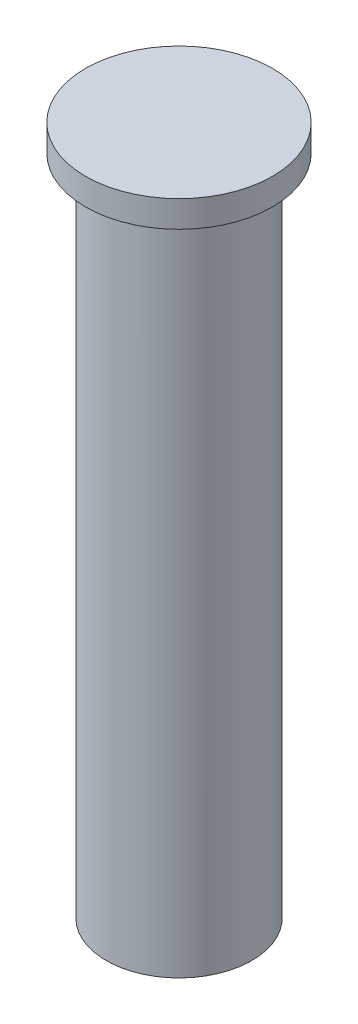
ISO-10303-21;
HEADER;
FILE_DESCRIPTION(('STEP AP214'),'2;1');
FILE_NAME('part.step','',(''),(''),'','','');
FILE_SCHEMA(('AUTOMOTIVE_DESIGN { 1 0 10303 214 1 1 1 1 }'));
ENDSEC;
DATA;
#1=APPLICATION_CONTEXT('core data for automotive mechanical design processes');
#2=APPLICATION_PROTOCOL_DEFINITION('international standard','automotive_design',2000,#1);
#3=PRODUCT_CONTEXT('',#1,'mechanical');
#4=PRODUCT('Part','Part','',(#3));
#5=PRODUCT_RELATED_PRODUCT_CATEGORY('part','',(#4));
#6=PRODUCT_DEFINITION_FORMATION('','',#4);
#7=PRODUCT_DEFINITION_CONTEXT('part definition',#1,'design');
#8=PRODUCT_DEFINITION('design','',#6,#7);
#9=PRODUCT_DEFINITION_SHAPE('','',#8);
#10=(LENGTH_UNIT() NAMED_UNIT(*) SI_UNIT(.MILLI.,.METRE.));
#11=(NAMED_UNIT(*) PLANE_ANGLE_UNIT() SI_UNIT($,.RADIAN.));
#12=(NAMED_UNIT(*) SI_UNIT($,.STERADIAN.) SOLID_ANGLE_UNIT());
#13=UNCERTAINTY_MEASURE_WITH_UNIT(LENGTH_MEASURE(1.E-05),#10,'distance_accuracy_value','');
#14=(GEOMETRIC_REPRESENTATION_CONTEXT(3) GLOBAL_UNCERTAINTY_ASSIGNED_CONTEXT((#13)) GLOBAL_UNIT_ASSIGNED_CONTEXT((#10,
#11,#12)) REPRESENTATION_CONTEXT('',''));
#15=CARTESIAN_POINT('',(0.,0.,0.));
#16=DIRECTION('',(0.,0.,1.));
#17=DIRECTION('',(1.,0.,0.));
#18=AXIS2_PLACEMENT_3D('',#15,#16,#17);
#19=CARTESIAN_POINT('',(0.,50.8,0.));
#20=DIRECTION('',(0.,-1.,0.));
#21=DIRECTION('',(0.,0.,-1.));
#22=AXIS2_PLACEMENT_3D('',#19,#20,#21);
#23=CYLINDRICAL_SURFACE('',#22,6.985);
#24=CARTESIAN_POINT('',(0.,50.8,0.));
#25=DIRECTION('',(0.,1.,0.));
#26=DIRECTION('',(0.,0.,1.));
#27=AXIS2_PLACEMENT_3D('',#24,#25,#26);
#28=CIRCLE('',#27,6.985);
#29=CARTESIAN_POINT('',(0.,50.8,6.985));
#30=VERTEX_POINT('',#29);
#31=EDGE_CURVE('E10',#30,#30,#28,.T.);
#32=ORIENTED_EDGE('',*,*,#31,.F.);
#33=EDGE_LOOP('',(#32));
#34=FACE_BOUND('',#33,.T.);
#35=CARTESIAN_POINT('',(0.,-12.7,0.));
#36=DIRECTION('',(0.,-1.,0.));
#37=DIRECTION('',(0.,0.,-1.));
#38=AXIS2_PLACEMENT_3D('',#35,#36,#37);
#39=CIRCLE('',#38,6.985);
#40=CARTESIAN_POINT('',(0.,-12.7,-6.985));
#41=VERTEX_POINT('',#40);
#42=EDGE_CURVE('E55',#41,#41,#39,.T.);
#43=ORIENTED_EDGE('',*,*,#42,.F.);
#44=EDGE_LOOP('',(#43));
#45=FACE_BOUND('',#44,.T.);
#46=ADVANCED_FACE('F37',(#34,#45),#23,.T.);
#47=CARTESIAN_POINT('',(0.,53.34,0.));
#48=DIRECTION('',(0.,-1.,0.));
#49=DIRECTION('',(0.,0.,-1.));
#50=AXIS2_PLACEMENT_3D('',#47,#48,#49);
#51=CYLINDRICAL_SURFACE('',#50,8.95691472582998);
#52=CARTESIAN_POINT('',(0.,53.34,0.));
#53=DIRECTION('',(0.,1.,0.));
#54=DIRECTION('',(0.,0.,1.));
#55=AXIS2_PLACEMENT_3D('',#52,#53,#54);
#56=CIRCLE('',#55,8.95691472582998);
#57=CARTESIAN_POINT('',(0.,53.34,8.95691472582998));
#58=VERTEX_POINT('',#57);
#59=EDGE_CURVE('E44',#58,#58,#56,.T.);
#60=ORIENTED_EDGE('',*,*,#59,.F.);
#61=EDGE_LOOP('',(#60));
#62=FACE_BOUND('',#61,.T.);
#63=CARTESIAN_POINT('',(0.,50.8,0.));
#64=DIRECTION('',(0.,1.,0.));
#65=DIRECTION('',(0.,0.,1.));
#66=AXIS2_PLACEMENT_3D('',#63,#64,#65);
#67=CIRCLE('',#66,8.95691472582998);
#68=CARTESIAN_POINT('',(0.,50.8,8.95691472582998));
#69=VERTEX_POINT('',#68);
#70=EDGE_CURVE('E49',#69,#69,#67,.T.);
#71=ORIENTED_EDGE('',*,*,#70,.T.);
#72=EDGE_LOOP('',(#71));
#73=FACE_BOUND('',#72,.T.);
#74=ADVANCED_FACE('F64',(#62,#73),#51,.T.);
#75=CARTESIAN_POINT('',(0.,53.34,0.));
#76=DIRECTION('',(0.,1.,0.));
#77=DIRECTION('',(0.,0.,1.));
#78=AXIS2_PLACEMENT_3D('',#75,#76,#77);
#79=PLANE('',#78);
#80=ORIENTED_EDGE('',*,*,#59,.T.);
#81=EDGE_LOOP('',(#80));
#82=FACE_BOUND('',#81,.T.);
#83=ADVANCED_FACE('F69',(#82),#79,.T.);
#84=CARTESIAN_POINT('',(0.,50.8,0.));
#85=DIRECTION('',(0.,1.,0.));
#86=DIRECTION('',(0.,0.,1.));
#87=AXIS2_PLACEMENT_3D('',#84,#85,#86);
#88=PLANE('',#87);
#89=ORIENTED_EDGE('',*,*,#31,.T.);
#90=EDGE_LOOP('',(#89));
#91=FACE_BOUND('',#90,.T.);
#92=ORIENTED_EDGE('',*,*,#70,.F.);
#93=EDGE_LOOP('',(#92));
#94=FACE_BOUND('',#93,.T.);
#95=ADVANCED_FACE('F74',(#91,#94),#88,.F.);
#96=CARTESIAN_POINT('',(0.,-12.7,0.));
#97=DIRECTION('',(0.,-1.,0.));
#98=DIRECTION('',(0.,0.,-1.));
#99=AXIS2_PLACEMENT_3D('',#96,#97,#98);
#100=PLANE('',#99);
#101=ORIENTED_EDGE('',*,*,#42,.T.);
#102=EDGE_LOOP('',(#101));
#103=FACE_BOUND('',#102,.T.);
#104=ADVANCED_FACE('F61',(#103),#100,.T.);
#105=CLOSED_SHELL('',(#46,#74,#83,#95,#104));
#106=MANIFOLD_SOLID_BREP('B2',#105);
#107=ADVANCED_BREP_SHAPE_REPRESENTATION('',(#18,#106),#14);
#108=SHAPE_DEFINITION_REPRESENTATION(#9,#107);
ENDSEC;
END-ISO-10303-21;
